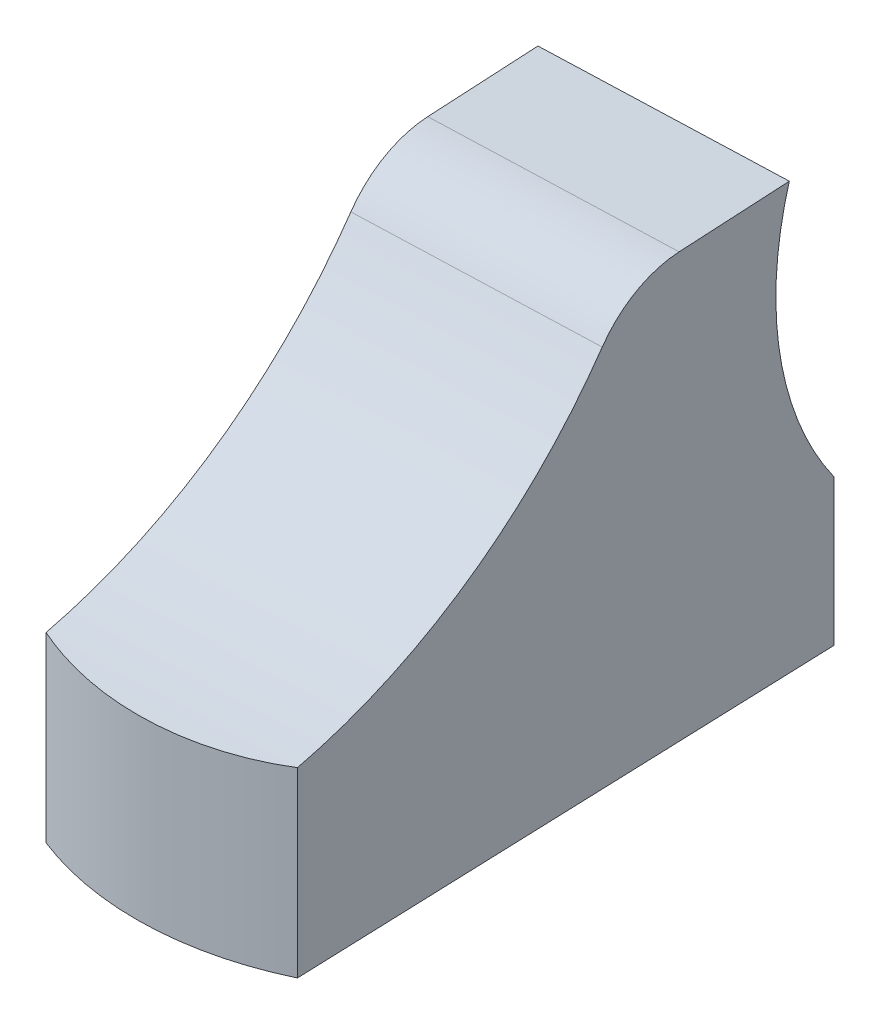
ISO-10303-21;
HEADER;
FILE_DESCRIPTION(('STEP AP214'),'2;1');
FILE_NAME('part.step','',(''),(''),'','','');
FILE_SCHEMA(('AUTOMOTIVE_DESIGN { 1 0 10303 214 1 1 1 1 }'));
ENDSEC;
DATA;
#1=APPLICATION_CONTEXT('core data for automotive mechanical design processes');
#2=APPLICATION_PROTOCOL_DEFINITION('international standard','automotive_design',2000,#1);
#3=PRODUCT_CONTEXT('',#1,'mechanical');
#4=PRODUCT('Part','Part','',(#3));
#5=PRODUCT_RELATED_PRODUCT_CATEGORY('part','',(#4));
#6=PRODUCT_DEFINITION_FORMATION('','',#4);
#7=PRODUCT_DEFINITION_CONTEXT('part definition',#1,'design');
#8=PRODUCT_DEFINITION('design','',#6,#7);
#9=PRODUCT_DEFINITION_SHAPE('','',#8);
#10=(LENGTH_UNIT() NAMED_UNIT(*) SI_UNIT(.MILLI.,.METRE.));
#11=(NAMED_UNIT(*) PLANE_ANGLE_UNIT() SI_UNIT($,.RADIAN.));
#12=(NAMED_UNIT(*) SI_UNIT($,.STERADIAN.) SOLID_ANGLE_UNIT());
#13=UNCERTAINTY_MEASURE_WITH_UNIT(LENGTH_MEASURE(1.E-05),#10,'distance_accuracy_value','');
#14=(GEOMETRIC_REPRESENTATION_CONTEXT(3) GLOBAL_UNCERTAINTY_ASSIGNED_CONTEXT((#13)) GLOBAL_UNIT_ASSIGNED_CONTEXT((#10,
#11,#12)) REPRESENTATION_CONTEXT('',''));
#15=CARTESIAN_POINT('',(0.,0.,0.));
#16=DIRECTION('',(0.,0.,1.));
#17=DIRECTION('',(1.,0.,0.));
#18=AXIS2_PLACEMENT_3D('',#15,#16,#17);
#19=CARTESIAN_POINT('',(-13.6560761414585,64.4275864647029,68.3445894880389));
#20=DIRECTION('',(0.,-1.,0.));
#21=DIRECTION('',(0.,0.,-1.));
#22=AXIS2_PLACEMENT_3D('',#19,#20,#21);
#23=CYLINDRICAL_SURFACE('',#22,30.);
#24=DIRECTION('',(0.,-1.,0.));
#25=VECTOR('',#24,1.);
#26=CARTESIAN_POINT('',(-0.686294868794308,64.4275864647029,95.3961102168121));
#27=LINE('',#26,#25);
#28=CARTESIAN_POINT('',(-0.686294868794308,17.9973793058777,95.3961102168121));
#29=VERTEX_POINT('',#28);
#30=CARTESIAN_POINT('',(-0.686294868794308,0.,95.3961102168121));
#31=VERTEX_POINT('',#30);
#32=EDGE_CURVE('E119',#29,#31,#27,.T.);
#33=ORIENTED_EDGE('',*,*,#32,.F.);
#34=CARTESIAN_POINT('',(-0.686294868794311,17.9973793058777,95.3961102168121));
#35=CARTESIAN_POINT('',(-1.05974883882785,17.964812931396,95.5751692402146));
#36=CARTESIAN_POINT('',(-1.43707817360394,17.9346209392194,95.746560085444));
#37=CARTESIAN_POINT('',(-2.19877873257007,17.8786044306291,96.0736721840138));
#38=CARTESIAN_POINT('',(-2.5831498131365,17.8527798252478,96.2293937565255));
#39=CARTESIAN_POINT('',(-3.35820128064955,17.8051179049133,96.5248265245844));
#40=CARTESIAN_POINT('',(-3.74888102849435,17.783280188791,96.6645393304397));
#41=CARTESIAN_POINT('',(-4.53584044646148,17.7432557303193,96.9276876909648));
#42=CARTESIAN_POINT('',(-4.93212013903908,17.7250690026147,97.0511231803436));
#43=CARTESIAN_POINT('',(-6.12848967706259,17.6755156736712,97.3966854711053));
#44=CARTESIAN_POINT('',(-6.93609991351215,17.6491565273538,97.5940642570189));
#45=CARTESIAN_POINT('',(-8.56506515256257,17.6079150422423,97.9211343103528));
#46=CARTESIAN_POINT('',(-9.38641994195623,17.5930325255895,98.0508266267313));
#47=CARTESIAN_POINT('',(-11.0374470909,17.5735955680434,98.2416368754995));
#48=CARTESIAN_POINT('',(-11.8671217910011,17.5690441202898,98.3027349320207));
#49=CARTESIAN_POINT('',(-13.5287474736862,17.5699159541091,98.3558350649001));
#50=CARTESIAN_POINT('',(-14.3606986732368,17.5753402220269,98.3478303084557));
#51=CARTESIAN_POINT('',(-16.0197730511482,17.5965823694039,98.2628424515245));
#52=CARTESIAN_POINT('',(-16.8469013718996,17.6123856296408,98.1859563178088));
#53=CARTESIAN_POINT('',(-18.4913204804953,17.6555673108262,97.9639845716023));
#54=CARTESIAN_POINT('',(-19.3086148497956,17.6829413779341,97.818924609132));
#55=CARTESIAN_POINT('',(-20.8951406864976,17.7498254223101,97.4689549298011));
#56=CARTESIAN_POINT('',(-21.6649784636822,17.7887992557305,97.2667057614868));
#57=CARTESIAN_POINT('',(-22.8045769225187,17.8582681722569,96.9183992514293));
#58=CARTESIAN_POINT('',(-23.1817015394028,17.883241434987,96.7948932466206));
#59=CARTESIAN_POINT('',(-23.9305952547781,17.9372087901168,96.5330911311819));
#60=CARTESIAN_POINT('',(-24.3023629967064,17.9662038819065,96.3947913463851));
#61=CARTESIAN_POINT('',(-24.6711275005706,17.9973793058777,96.2492242922451));
#62=B_SPLINE_CURVE_WITH_KNOTS('',3,(#34,#35,#36,#37,#38,#39,#40,#41,#42,#43,#44,#45,#46,#47,#48,
#49,#50,#51,#52,#53,#54,#55,#56,#57,#58,#59,#60,#61),.UNSPECIFIED.,.F.,.F.,(4,2,2,2,2,2,2,2,2,2,
2,2,2,4),(0.,1.24621257315431,2.49239975676505,3.73846147723687,4.98452819572265,
7.4766939071559,9.96882099558024,12.4616700163765,14.954765529891,17.4443569291657,
19.9330123826217,22.3209225157916,23.5134897078523,24.7063537752918),.UNSPECIFIED.);
#63=CARTESIAN_POINT('',(-24.6711275005706,17.9973793058777,96.2492242922451));
#64=VERTEX_POINT('',#63);
#65=EDGE_CURVE('E41',#29,#64,#62,.T.);
#66=ORIENTED_EDGE('',*,*,#65,.T.);
#67=DIRECTION('',(0.,-1.,0.));
#68=VECTOR('',#67,1.);
#69=CARTESIAN_POINT('',(-24.6711275005706,64.4275864647029,96.2492242922451));
#70=LINE('',#69,#68);
#71=CARTESIAN_POINT('',(-24.6711275005706,0.,96.2492242922451));
#72=VERTEX_POINT('',#71);
#73=EDGE_CURVE('E117',#64,#72,#70,.T.);
#74=ORIENTED_EDGE('',*,*,#73,.T.);
#75=CARTESIAN_POINT('',(-13.6560761414585,0.,68.3445894880389));
#76=DIRECTION('',(0.,1.,0.));
#77=DIRECTION('',(0.,0.,1.));
#78=AXIS2_PLACEMENT_3D('',#75,#76,#77);
#79=CIRCLE('',#78,30.);
#80=EDGE_CURVE('E142',#72,#31,#79,.T.);
#81=ORIENTED_EDGE('',*,*,#80,.T.);
#82=EDGE_LOOP('',(#33,#66,#74,#81));
#83=FACE_BOUND('',#82,.T.);
#84=ADVANCED_FACE('F33',(#83),#23,.T.);
#85=CARTESIAN_POINT('',(-0.686294868794308,64.4275864647029,95.3961102168121));
#86=DIRECTION('',(-0.999368026323993,0.,0.0355464198097012));
#87=DIRECTION('',(0.0355464198097012,0.,0.999368026323993));
#88=AXIS2_PLACEMENT_3D('',#85,#86,#87);
#89=PLANE('',#88);
#90=DIRECTION('',(0.,-1.,0.));
#91=VECTOR('',#90,1.);
#92=CARTESIAN_POINT('',(-2.64102478234589,64.4275864647029,40.4399546838325));
#93=LINE('',#92,#91);
#94=CARTESIAN_POINT('',(-2.64102478234591,14.4340784939864,40.4399546838325));
#95=VERTEX_POINT('',#94);
#96=CARTESIAN_POINT('',(-2.64102478234589,0.,40.4399546838325));
#97=VERTEX_POINT('',#96);
#98=EDGE_CURVE('E116',#95,#97,#93,.T.);
#99=ORIENTED_EDGE('',*,*,#98,.F.);
#100=CARTESIAN_POINT('',(-3.54915707915285,32.8612506315206,14.9083150430567));
#101=DIRECTION('',(-0.999368026323993,0.,0.0355464198097012));
#102=DIRECTION('',(0.0355464198097012,0.,0.999368026323993));
#103=AXIS2_PLACEMENT_3D('',#100,#101,#102);
#104=CIRCLE('',#103,31.50000000002);
#105=CARTESIAN_POINT('',(-2.4785455768413,42.0870121878553,45.0079681094632));
#106=VERTEX_POINT('',#105);
#107=EDGE_CURVE('E97',#95,#106,#104,.T.);
#108=ORIENTED_EDGE('',*,*,#107,.T.);
#109=DIRECTION('',(0.0355410059177912,-0.0174524064372761,0.999215817733036));
#110=VECTOR('',#109,1.);
#111=CARTESIAN_POINT('',(-0.700698087995305,41.2140004044916,94.9911716372682));
#112=LINE('',#111,#110);
#113=CARTESIAN_POINT('',(-2.07695036906165,41.8898089121336,56.2985963169882));
#114=VERTEX_POINT('',#113);
#115=EDGE_CURVE('E133',#106,#114,#112,.T.);
#116=ORIENTED_EDGE('',*,*,#115,.T.);
#117=CARTESIAN_POINT('',(-2.08315407472073,31.8913319605696,56.12418254723));
#118=DIRECTION('',(-0.999368026323993,0.,0.0355464198097012));
#119=DIRECTION('',(0.0355464198097012,0.,0.999368026323993));
#120=AXIS2_PLACEMENT_3D('',#117,#118,#119);
#121=CIRCLE('',#120,10.);
#122=CARTESIAN_POINT('',(-1.79682605914909,37.8172283524062,64.1741370949723));
#123=VERTEX_POINT('',#122);
#124=EDGE_CURVE('E189',#114,#123,#121,.F.);
#125=ORIENTED_EDGE('',*,*,#124,.T.);
#126=CARTESIAN_POINT('',(-0.336553179733926,68.0392999507725,105.228905288458));
#127=DIRECTION('',(-0.999368026323993,0.,0.0355464198097012));
#128=DIRECTION('',(0.0355464198097012,0.,0.999368026323993));
#129=AXIS2_PLACEMENT_3D('',#126,#127,#128);
#130=CIRCLE('',#129,51.);
#131=EDGE_CURVE('E128',#123,#29,#130,.T.);
#132=ORIENTED_EDGE('',*,*,#131,.T.);
#133=ORIENTED_EDGE('',*,*,#32,.T.);
#134=DIRECTION('',(-0.0355464198097012,0.,-0.999368026323993));
#135=VECTOR('',#134,1.);
#136=CARTESIAN_POINT('',(-0.686294868794308,0.,95.3961102168121));
#137=LINE('',#136,#135);
#138=EDGE_CURVE('E187',#31,#97,#137,.T.);
#139=ORIENTED_EDGE('',*,*,#138,.T.);
#140=EDGE_LOOP('',(#99,#108,#116,#125,#132,#133,#139));
#141=FACE_BOUND('',#140,.T.);
#142=ADVANCED_FACE('F159',(#141),#89,.F.);
#143=CARTESIAN_POINT('',(-13.6560761414585,64.4275864647029,68.3445894880389));
#144=DIRECTION('',(0.,-1.,0.));
#145=DIRECTION('',(0.,0.,-1.));
#146=AXIS2_PLACEMENT_3D('',#143,#144,#145);
#147=CYLINDRICAL_SURFACE('',#146,30.0000000000002);
#148=DIRECTION('',(0.,-1.,0.));
#149=VECTOR('',#148,1.);
#150=CARTESIAN_POINT('',(-26.6258574141221,64.4275864647029,41.2930687592652));
#151=LINE('',#150,#149);
#152=CARTESIAN_POINT('',(-26.6258574141221,14.4340784939861,41.2930687592652));
#153=VERTEX_POINT('',#152);
#154=CARTESIAN_POINT('',(-26.6258574141221,0.,41.2930687592652));
#155=VERTEX_POINT('',#154);
#156=EDGE_CURVE('E107',#153,#155,#151,.T.);
#157=ORIENTED_EDGE('',*,*,#156,.F.);
#158=CARTESIAN_POINT('',(-26.6258574141221,14.4340784939861,41.2930687592652));
#159=CARTESIAN_POINT('',(-26.4026124243101,14.2967718842339,41.1860263606362));
#160=CARTESIAN_POINT('',(-26.1756541802352,14.1642400618823,41.0806186903432));
#161=CARTESIAN_POINT('',(-25.7147322721686,13.9087162434355,40.8736499896716));
#162=CARTESIAN_POINT('',(-25.480768831757,13.7857239433225,40.7720888367602));
#163=CARTESIAN_POINT('',(-25.0063149709513,13.5492963661891,40.5734134539917));
#164=CARTESIAN_POINT('',(-24.7658265426476,13.4358582147283,40.4762978906871));
#165=CARTESIAN_POINT('',(-24.2787222366989,13.2184559581741,40.2870110204327));
#166=CARTESIAN_POINT('',(-24.0321063285343,13.1144919002812,40.1948397381166));
#167=CARTESIAN_POINT('',(-23.2846728356819,12.817086359931,39.9268199137567));
#168=CARTESIAN_POINT('',(-22.7752696791031,12.6376357390654,39.7590441301242));
#169=CARTESIAN_POINT('',(-21.7376302929171,12.3155126730038,39.4485353644505));
#170=CARTESIAN_POINT('',(-21.2093932090413,12.172841898489,39.3058035200946));
#171=CARTESIAN_POINT('',(-20.1382561814323,11.9235147433021,39.0480960690915));
#172=CARTESIAN_POINT('',(-19.5953664745111,11.8168338880235,38.9331016151215));
#173=CARTESIAN_POINT('',(-18.4984809178721,11.6386052908242,38.7327340926585));
#174=CARTESIAN_POINT('',(-17.9444850044165,11.5670577505914,38.6473611942132));
#175=CARTESIAN_POINT('',(-16.8290634074197,11.4584945593169,38.5075623666453));
#176=CARTESIAN_POINT('',(-16.2676352558977,11.4214906863224,38.4531469953037));
#177=CARTESIAN_POINT('',(-15.1414044792796,11.3817339490505,38.3760661170729));
#178=CARTESIAN_POINT('',(-14.5766018719491,11.378980904612,38.3534004431792));
#179=CARTESIAN_POINT('',(-13.4404590573464,11.4078788342507,38.339919069497));
#180=CARTESIAN_POINT('',(-12.869124898702,11.4399580879058,38.3495029664353));
#181=CARTESIAN_POINT('',(-11.730974834075,11.5394920255286,38.4010009244803));
#182=CARTESIAN_POINT('',(-11.1641591732418,11.6069486157971,38.4429167278427));
#183=CARTESIAN_POINT('',(-10.0394938752864,11.7777576655906,38.5580202136735));
#184=CARTESIAN_POINT('',(-9.48163955300533,11.8810906838287,38.6311909641518));
#185=CARTESIAN_POINT('',(-8.3787947447794,12.124421418667,38.8071228099693));
#186=CARTESIAN_POINT('',(-7.8338019351762,12.2644124562067,38.9098785152934));
#187=CARTESIAN_POINT('',(-6.88411230233535,12.5454108314305,39.1158454111237));
#188=CARTESIAN_POINT('',(-6.47593682956976,12.6788030292309,39.2135336714676));
#189=CARTESIAN_POINT('',(-5.67162093489573,12.9681758337986,39.4236421255385));
#190=CARTESIAN_POINT('',(-5.27547828221192,13.1241522223579,39.5360595678207));
#191=CARTESIAN_POINT('',(-4.49707808599361,13.4589872005451,39.7740067001071));
#192=CARTESIAN_POINT('',(-4.11481954180812,13.6378441369152,39.8995354426205));
#193=CARTESIAN_POINT('',(-3.36581279165374,14.0186300036183,40.16181630208));
#194=CARTESIAN_POINT('',(-2.99906921283498,14.2205657513823,40.2985717319872));
#195=CARTESIAN_POINT('',(-2.64102478234587,14.4340784939863,40.4399546838325));
#196=B_SPLINE_CURVE_WITH_KNOTS('',3,(#158,#159,#160,#161,#162,#163,#164,#165,#166,#167,#168,
#169,#170,#171,#172,#173,#174,#175,#176,#177,#178,#179,#180,#181,#182,#183,#184,#185,#186,#187,
#188,#189,#190,#191,#192,#193,#194,#195),.UNSPECIFIED.,.F.,.F.,(4,2,2,2,2,2,2,2,2,2,2,2,2,2,2,2,
2,2,4),(0.,0.849242008365056,1.69845694086959,2.54741546089385,3.39637821024539,
5.09073725122284,6.78517324289728,8.47845461554077,10.1717457086016,11.8656139374299,
13.5594732564177,15.2743976769096,16.9894145152633,18.7035034399401,20.4172802760768,
21.7375212697372,23.0575159900477,24.3774153865851,25.6977056912535),.UNSPECIFIED.);
#197=EDGE_CURVE('E91',#153,#95,#196,.T.);
#198=ORIENTED_EDGE('',*,*,#197,.T.);
#199=ORIENTED_EDGE('',*,*,#98,.T.);
#200=CARTESIAN_POINT('',(-13.6560761414585,0.,68.3445894880389));
#201=DIRECTION('',(0.,1.,0.));
#202=DIRECTION('',(0.,0.,1.));
#203=AXIS2_PLACEMENT_3D('',#200,#201,#202);
#204=CIRCLE('',#203,30.0000000000002);
#205=EDGE_CURVE('E114',#97,#155,#204,.T.);
#206=ORIENTED_EDGE('',*,*,#205,.T.);
#207=EDGE_LOOP('',(#157,#198,#199,#206));
#208=FACE_BOUND('',#207,.T.);
#209=ADVANCED_FACE('F112',(#208),#147,.T.);
#210=CARTESIAN_POINT('',(-26.6258574141221,64.4275864647029,41.2930687592652));
#211=DIRECTION('',(0.999368026323993,0.,-0.0355464198097002));
#212=DIRECTION('',(-0.0355464198097002,0.,-0.999368026323993));
#213=AXIS2_PLACEMENT_3D('',#210,#211,#212);
#214=PLANE('',#213);
#215=DIRECTION('',(0.0355410059177903,-0.0174524064372761,0.999215817733036));
#216=VECTOR('',#215,1.);
#217=CARTESIAN_POINT('',(-26.4633782086183,42.0870121878556,45.8610821848753));
#218=LINE('',#217,#216);
#219=CARTESIAN_POINT('',(-26.4633782086183,42.0870121878556,45.8610821848753));
#220=VERTEX_POINT('',#219);
#221=CARTESIAN_POINT('',(-26.0617830008379,41.8898089121336,57.1517103924211));
#222=VERTEX_POINT('',#221);
#223=EDGE_CURVE('E101',#220,#222,#218,.T.);
#224=ORIENTED_EDGE('',*,*,#223,.F.);
#225=CARTESIAN_POINT('',(-27.5339897109291,32.8612506315206,15.7614291184895));
#226=DIRECTION('',(-0.999368026323993,0.,0.0355464198097003));
#227=DIRECTION('',(-0.0355464198097003,0.,-0.999368026323993));
#228=AXIS2_PLACEMENT_3D('',#225,#226,#227);
#229=CIRCLE('',#228,31.50000000002);
#230=EDGE_CURVE('E94',#153,#220,#229,.T.);
#231=ORIENTED_EDGE('',*,*,#230,.F.);
#232=ORIENTED_EDGE('',*,*,#156,.T.);
#233=DIRECTION('',(0.0355464198097003,0.,0.999368026323993));
#234=VECTOR('',#233,1.);
#235=CARTESIAN_POINT('',(-26.6258574141221,0.,41.2930687592652));
#236=LINE('',#235,#234);
#237=EDGE_CURVE('E121',#155,#72,#236,.T.);
#238=ORIENTED_EDGE('',*,*,#237,.T.);
#239=ORIENTED_EDGE('',*,*,#73,.F.);
#240=CARTESIAN_POINT('',(-24.3213858115102,68.0392999507725,106.082019363891));
#241=DIRECTION('',(0.999368026323993,0.,-0.0355464198097002));
#242=DIRECTION('',(-0.0355464198097002,0.,-0.999368026323993));
#243=AXIS2_PLACEMENT_3D('',#240,#241,#242);
#244=CIRCLE('',#243,51.);
#245=CARTESIAN_POINT('',(-25.7816586909254,37.8172283524061,65.0272511704051));
#246=VERTEX_POINT('',#245);
#247=EDGE_CURVE('E54',#64,#246,#244,.T.);
#248=ORIENTED_EDGE('',*,*,#247,.T.);
#249=CARTESIAN_POINT('',(-26.067986706497,31.8913319605696,56.9772966226628));
#250=DIRECTION('',(0.999368026323993,0.,-0.0355464198097003));
#251=DIRECTION('',(0.0355464198097003,0.,0.999368026323993));
#252=AXIS2_PLACEMENT_3D('',#249,#250,#251);
#253=CIRCLE('',#252,10.);
#254=EDGE_CURVE('E48',#222,#246,#253,.T.);
#255=ORIENTED_EDGE('',*,*,#254,.F.);
#256=EDGE_LOOP('',(#224,#231,#232,#238,#239,#248,#255));
#257=FACE_BOUND('',#256,.T.);
#258=ADVANCED_FACE('F105',(#257),#214,.F.);
#259=CARTESIAN_POINT('',(-13.6560761414585,0.,68.3445894880389));
#260=DIRECTION('',(0.,1.,0.));
#261=DIRECTION('',(0.,0.,1.));
#262=AXIS2_PLACEMENT_3D('',#259,#260,#261);
#263=PLANE('',#262);
#264=CARTESIAN_POINT('',(-14.4558705871766,0.,45.8588088957486));
#265=DIRECTION('',(0.,-1.,0.));
#266=DIRECTION('',(0.,0.,-1.));
#267=AXIS2_PLACEMENT_3D('',#264,#265,#266);
#268=CIRCLE('',#267,2.75000000000002);
#269=CARTESIAN_POINT('',(-14.4558705871766,0.,43.1088088957486));
#270=VERTEX_POINT('',#269);
#271=EDGE_CURVE('E271',#270,#270,#268,.T.);
#272=ORIENTED_EDGE('',*,*,#271,.F.);
#273=EDGE_LOOP('',(#272));
#274=FACE_BOUND('',#273,.T.);
#275=CARTESIAN_POINT('',(-12.8562816957401,0.,90.8303700803283));
#276=DIRECTION('',(0.,-1.,0.));
#277=DIRECTION('',(0.,0.,-1.));
#278=AXIS2_PLACEMENT_3D('',#275,#276,#277);
#279=CIRCLE('',#278,2.75);
#280=CARTESIAN_POINT('',(-12.8562816957401,0.,88.0803700803283));
#281=VERTEX_POINT('',#280);
#282=EDGE_CURVE('E279',#281,#281,#279,.T.);
#283=ORIENTED_EDGE('',*,*,#282,.F.);
#284=EDGE_LOOP('',(#283));
#285=FACE_BOUND('',#284,.T.);
#286=ORIENTED_EDGE('',*,*,#80,.F.);
#287=ORIENTED_EDGE('',*,*,#237,.F.);
#288=ORIENTED_EDGE('',*,*,#205,.F.);
#289=ORIENTED_EDGE('',*,*,#138,.F.);
#290=EDGE_LOOP('',(#286,#287,#288,#289));
#291=FACE_BOUND('',#290,.T.);
#292=ADVANCED_FACE('F150',(#274,#285,#291),#263,.F.);
#293=CARTESIAN_POINT('',(69.1195246497837,68.0392999507725,102.758429111684));
#294=DIRECTION('',(-0.999368026323993,0.,0.0355464198097005));
#295=DIRECTION('',(-0.0246926180606589,0.719339800338625,-0.694219364655076));
#296=AXIS2_PLACEMENT_3D('',#293,#294,#295);
#297=CYLINDRICAL_SURFACE('',#296,51.);
#298=ORIENTED_EDGE('',*,*,#131,.F.);
#299=DIRECTION('',(-0.999368026323993,0.,0.0355464198097003));
#300=VECTOR('',#299,1.);
#301=CARTESIAN_POINT('',(29.1835827568942,37.8172283524062,63.0721980808716));
#302=LINE('',#301,#300);
#303=EDGE_CURVE('E11',#123,#246,#302,.T.);
#304=ORIENTED_EDGE('',*,*,#303,.T.);
#305=ORIENTED_EDGE('',*,*,#247,.F.);
#306=ORIENTED_EDGE('',*,*,#65,.F.);
#307=EDGE_LOOP('',(#298,#304,#305,#306));
#308=FACE_BOUND('',#307,.T.);
#309=ADVANCED_FACE('F144',(#308),#297,.F.);
#310=CARTESIAN_POINT('',(83.4671046870209,42.0870121878556,41.9509760058083));
#311=DIRECTION('',(-0.000620370565908931,-0.999847695156391,-0.0174413769758247));
#312=DIRECTION('',(0.,0.0174413803320667,-0.999847887556959));
#313=AXIS2_PLACEMENT_3D('',#310,#311,#312);
#314=PLANE('',#313);
#315=DIRECTION('',(-0.999368026323993,0.,0.0355464198097003));
#316=VECTOR('',#315,1.);
#317=CARTESIAN_POINT('',(83.4671046870209,42.0870121878556,41.9509760058083));
#318=LINE('',#317,#316);
#319=EDGE_CURVE('E194',#106,#220,#318,.T.);
#320=ORIENTED_EDGE('',*,*,#319,.T.);
#321=ORIENTED_EDGE('',*,*,#223,.T.);
#322=DIRECTION('',(-0.999368026323993,0.,0.0355464198097003));
#323=VECTOR('',#322,1.);
#324=CARTESIAN_POINT('',(83.8686998948013,41.8898089121336,53.241604213354));
#325=LINE('',#324,#323);
#326=EDGE_CURVE('E192',#114,#222,#325,.T.);
#327=ORIENTED_EDGE('',*,*,#326,.F.);
#328=ORIENTED_EDGE('',*,*,#115,.F.);
#329=EDGE_LOOP('',(#320,#321,#327,#328));
#330=FACE_BOUND('',#329,.T.);
#331=ADVANCED_FACE('F149',(#330),#314,.F.);
#332=CARTESIAN_POINT('',(83.8624961891422,31.8913319605696,53.0671904435958));
#333=DIRECTION('',(-0.999368026323993,0.,0.0355464198097003));
#334=DIRECTION('',(0.0355464198097003,0.,0.999368026323993));
#335=AXIS2_PLACEMENT_3D('',#332,#333,#334);
#336=CYLINDRICAL_SURFACE('',#335,10.);
#337=ORIENTED_EDGE('',*,*,#326,.T.);
#338=ORIENTED_EDGE('',*,*,#254,.T.);
#339=ORIENTED_EDGE('',*,*,#303,.F.);
#340=ORIENTED_EDGE('',*,*,#124,.F.);
#341=EDGE_LOOP('',(#337,#338,#339,#340));
#342=FACE_BOUND('',#341,.T.);
#343=ADVANCED_FACE('F172',(#342),#336,.T.);
#344=CARTESIAN_POINT('',(82.3964931847102,32.8612506315206,11.8513229394225));
#345=DIRECTION('',(-0.999368026323993,0.,0.0355464198097003));
#346=DIRECTION('',(0.0355464198097003,0.,0.999368026323993));
#347=AXIS2_PLACEMENT_3D('',#344,#345,#346);
#348=CYLINDRICAL_SURFACE('',#347,31.50000000002);
#349=ORIENTED_EDGE('',*,*,#230,.T.);
#350=ORIENTED_EDGE('',*,*,#319,.F.);
#351=ORIENTED_EDGE('',*,*,#107,.F.);
#352=ORIENTED_EDGE('',*,*,#197,.F.);
#353=EDGE_LOOP('',(#349,#350,#351,#352));
#354=FACE_BOUND('',#353,.T.);
#355=ADVANCED_FACE('F93',(#354),#348,.F.);
#356=CARTESIAN_POINT('',(-12.8562816957401,11.,90.8303700803283));
#357=DIRECTION('',(0.,-1.,0.));
#358=DIRECTION('',(0.,0.,-1.));
#359=AXIS2_PLACEMENT_3D('',#356,#357,#358);
#360=CYLINDRICAL_SURFACE('',#359,2.75);
#361=CARTESIAN_POINT('',(-12.8562816957401,11.,90.8303700803283));
#362=DIRECTION('',(0.,-1.,0.));
#363=DIRECTION('',(0.,0.,-1.));
#364=AXIS2_PLACEMENT_3D('',#361,#362,#363);
#365=CIRCLE('',#364,2.75);
#366=CARTESIAN_POINT('',(-12.8562816957401,11.,88.0803700803283));
#367=VERTEX_POINT('',#366);
#368=EDGE_CURVE('E274',#367,#367,#365,.T.);
#369=ORIENTED_EDGE('',*,*,#368,.F.);
#370=EDGE_LOOP('',(#369));
#371=FACE_BOUND('',#370,.T.);
#372=ORIENTED_EDGE('',*,*,#282,.T.);
#373=EDGE_LOOP('',(#372));
#374=FACE_BOUND('',#373,.T.);
#375=ADVANCED_FACE('F171',(#371,#374),#360,.F.);
#376=CARTESIAN_POINT('',(-12.8562816957401,11.,90.8303700803283));
#377=DIRECTION('',(0.,-1.,0.));
#378=DIRECTION('',(0.,0.,-1.));
#379=AXIS2_PLACEMENT_3D('',#376,#377,#378);
#380=PLANE('',#379);
#381=ORIENTED_EDGE('',*,*,#368,.T.);
#382=EDGE_LOOP('',(#381));
#383=FACE_BOUND('',#382,.T.);
#384=ADVANCED_FACE('F237',(#383),#380,.T.);
#385=CARTESIAN_POINT('',(-14.4558705871766,11.,45.8588088957486));
#386=DIRECTION('',(0.,-1.,0.));
#387=DIRECTION('',(0.,0.,-1.));
#388=AXIS2_PLACEMENT_3D('',#385,#386,#387);
#389=CYLINDRICAL_SURFACE('',#388,2.75000000000002);
#390=CARTESIAN_POINT('',(-14.4558705871766,11.,45.8588088957486));
#391=DIRECTION('',(0.,-1.,0.));
#392=DIRECTION('',(0.,0.,-1.));
#393=AXIS2_PLACEMENT_3D('',#390,#391,#392);
#394=CIRCLE('',#393,2.75000000000002);
#395=CARTESIAN_POINT('',(-14.4558705871766,11.,43.1088088957486));
#396=VERTEX_POINT('',#395);
#397=EDGE_CURVE('E110',#396,#396,#394,.T.);
#398=ORIENTED_EDGE('',*,*,#397,.F.);
#399=EDGE_LOOP('',(#398));
#400=FACE_BOUND('',#399,.T.);
#401=ORIENTED_EDGE('',*,*,#271,.T.);
#402=EDGE_LOOP('',(#401));
#403=FACE_BOUND('',#402,.T.);
#404=ADVANCED_FACE('F243',(#400,#403),#389,.F.);
#405=CARTESIAN_POINT('',(-14.4558705871766,11.,45.8588088957486));
#406=DIRECTION('',(0.,-1.,0.));
#407=DIRECTION('',(0.,0.,-1.));
#408=AXIS2_PLACEMENT_3D('',#405,#406,#407);
#409=PLANE('',#408);
#410=ORIENTED_EDGE('',*,*,#397,.T.);
#411=EDGE_LOOP('',(#410));
#412=FACE_BOUND('',#411,.T.);
#413=ADVANCED_FACE('F250',(#412),#409,.T.);
#414=CLOSED_SHELL('',(#84,#142,#209,#258,#292,#309,#331,#343,#355,#375,#384,#404,#413));
#415=MANIFOLD_SOLID_BREP('B2',#414);
#416=ADVANCED_BREP_SHAPE_REPRESENTATION('',(#18,#415),#14);
#417=SHAPE_DEFINITION_REPRESENTATION(#9,#416);
ENDSEC;
END-ISO-10303-21;
